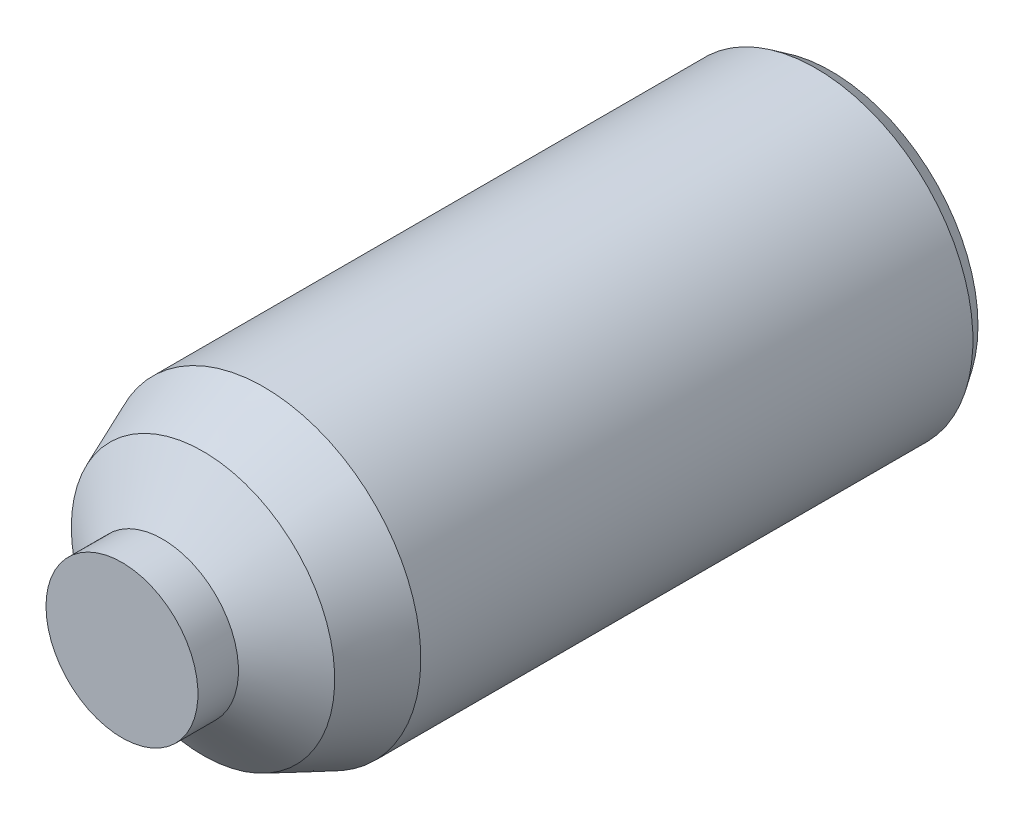
ISO-10303-21;
HEADER;
FILE_DESCRIPTION(('STEP AP214'),'2;1');
FILE_NAME('part.step','',(''),(''),'','','');
FILE_SCHEMA(('AUTOMOTIVE_DESIGN { 1 0 10303 214 1 1 1 1 }'));
ENDSEC;
DATA;
#1=APPLICATION_CONTEXT('core data for automotive mechanical design processes');
#2=APPLICATION_PROTOCOL_DEFINITION('international standard','automotive_design',2000,#1);
#3=PRODUCT_CONTEXT('',#1,'mechanical');
#4=PRODUCT('Part','Part','',(#3));
#5=PRODUCT_RELATED_PRODUCT_CATEGORY('part','',(#4));
#6=PRODUCT_DEFINITION_FORMATION('','',#4);
#7=PRODUCT_DEFINITION_CONTEXT('part definition',#1,'design');
#8=PRODUCT_DEFINITION('design','',#6,#7);
#9=PRODUCT_DEFINITION_SHAPE('','',#8);
#10=(LENGTH_UNIT() NAMED_UNIT(*) SI_UNIT(.MILLI.,.METRE.));
#11=(NAMED_UNIT(*) PLANE_ANGLE_UNIT() SI_UNIT($,.RADIAN.));
#12=(NAMED_UNIT(*) SI_UNIT($,.STERADIAN.) SOLID_ANGLE_UNIT());
#13=UNCERTAINTY_MEASURE_WITH_UNIT(LENGTH_MEASURE(1.E-05),#10,'distance_accuracy_value','');
#14=(GEOMETRIC_REPRESENTATION_CONTEXT(3) GLOBAL_UNCERTAINTY_ASSIGNED_CONTEXT((#13)) GLOBAL_UNIT_ASSIGNED_CONTEXT((#10,
#11,#12)) REPRESENTATION_CONTEXT('',''));
#15=CARTESIAN_POINT('',(0.,0.,0.));
#16=DIRECTION('',(0.,0.,1.));
#17=DIRECTION('',(1.,0.,0.));
#18=AXIS2_PLACEMENT_3D('',#15,#16,#17);
#19=CARTESIAN_POINT('',(15.,0.,140.));
#20=DIRECTION('',(0.,0.,-1.));
#21=DIRECTION('',(-1.,0.,0.));
#22=AXIS2_PLACEMENT_3D('',#19,#20,#21);
#23=PLANE('',#22);
#24=CARTESIAN_POINT('',(0.,0.,140.));
#25=DIRECTION('',(0.,0.,-1.));
#26=DIRECTION('',(-1.,0.,0.));
#27=AXIS2_PLACEMENT_3D('',#24,#25,#26);
#28=CIRCLE('',#27,15.);
#29=CARTESIAN_POINT('',(-15.,0.,140.));
#30=VERTEX_POINT('',#29);
#31=EDGE_CURVE('E62',#30,#30,#28,.T.);
#32=ORIENTED_EDGE('',*,*,#31,.F.);
#33=EDGE_LOOP('',(#32));
#34=FACE_BOUND('',#33,.T.);
#35=ADVANCED_FACE('F39',(#34),#23,.F.);
#36=CARTESIAN_POINT('',(0.,0.,0.));
#37=DIRECTION('',(0.,0.,1.));
#38=DIRECTION('',(1.,0.,0.));
#39=AXIS2_PLACEMENT_3D('',#36,#37,#38);
#40=PLANE('',#39);
#41=CARTESIAN_POINT('',(0.,0.,0.));
#42=DIRECTION('',(0.,0.,-1.));
#43=DIRECTION('',(-1.,0.,0.));
#44=AXIS2_PLACEMENT_3D('',#41,#42,#43);
#45=CIRCLE('',#44,29.);
#46=CARTESIAN_POINT('',(-29.,0.,0.));
#47=VERTEX_POINT('',#46);
#48=EDGE_CURVE('E10',#47,#47,#45,.T.);
#49=ORIENTED_EDGE('',*,*,#48,.T.);
#50=EDGE_LOOP('',(#49));
#51=FACE_BOUND('',#50,.T.);
#52=ADVANCED_FACE('F66',(#51),#40,.F.);
#53=CARTESIAN_POINT('',(0.,0.,3.));
#54=DIRECTION('',(0.,0.,1.));
#55=DIRECTION('',(1.,0.,0.));
#56=AXIS2_PLACEMENT_3D('',#53,#54,#55);
#57=CONICAL_SURFACE('',#56,31.,0.588002603547567);
#58=ORIENTED_EDGE('',*,*,#48,.F.);
#59=EDGE_LOOP('',(#58));
#60=FACE_BOUND('',#59,.T.);
#61=CARTESIAN_POINT('',(0.,0.,3.));
#62=DIRECTION('',(0.,0.,-1.));
#63=DIRECTION('',(-1.,0.,0.));
#64=AXIS2_PLACEMENT_3D('',#61,#62,#63);
#65=CIRCLE('',#64,31.);
#66=CARTESIAN_POINT('',(-31.,0.,3.));
#67=VERTEX_POINT('',#66);
#68=EDGE_CURVE('E44',#67,#67,#65,.T.);
#69=ORIENTED_EDGE('',*,*,#68,.T.);
#70=EDGE_LOOP('',(#69));
#71=FACE_BOUND('',#70,.T.);
#72=ADVANCED_FACE('F75',(#60,#71),#57,.T.);
#73=CARTESIAN_POINT('',(0.,0.,-5.));
#74=DIRECTION('',(0.,0.,-1.));
#75=DIRECTION('',(-1.,0.,0.));
#76=AXIS2_PLACEMENT_3D('',#73,#74,#75);
#77=CYLINDRICAL_SURFACE('',#76,31.);
#78=ORIENTED_EDGE('',*,*,#68,.F.);
#79=EDGE_LOOP('',(#78));
#80=FACE_BOUND('',#79,.T.);
#81=CARTESIAN_POINT('',(0.,0.,112.));
#82=DIRECTION('',(0.,0.,-1.));
#83=DIRECTION('',(-1.,0.,0.));
#84=AXIS2_PLACEMENT_3D('',#81,#82,#83);
#85=CIRCLE('',#84,31.);
#86=CARTESIAN_POINT('',(-31.,0.,112.));
#87=VERTEX_POINT('',#86);
#88=EDGE_CURVE('E47',#87,#87,#85,.T.);
#89=ORIENTED_EDGE('',*,*,#88,.T.);
#90=EDGE_LOOP('',(#89));
#91=FACE_BOUND('',#90,.T.);
#92=ADVANCED_FACE('F78',(#80,#91),#77,.T.);
#93=CARTESIAN_POINT('',(0.,0.,124.));
#94=DIRECTION('',(0.,0.,-1.));
#95=DIRECTION('',(-1.,0.,0.));
#96=AXIS2_PLACEMENT_3D('',#93,#94,#95);
#97=CONICAL_SURFACE('',#96,26.,0.394791119699761);
#98=ORIENTED_EDGE('',*,*,#88,.F.);
#99=EDGE_LOOP('',(#98));
#100=FACE_BOUND('',#99,.T.);
#101=CARTESIAN_POINT('',(0.,0.,124.));
#102=DIRECTION('',(0.,0.,-1.));
#103=DIRECTION('',(-1.,0.,0.));
#104=AXIS2_PLACEMENT_3D('',#101,#102,#103);
#105=CIRCLE('',#104,26.);
#106=CARTESIAN_POINT('',(-26.,0.,124.));
#107=VERTEX_POINT('',#106);
#108=EDGE_CURVE('E52',#107,#107,#105,.T.);
#109=ORIENTED_EDGE('',*,*,#108,.T.);
#110=EDGE_LOOP('',(#109));
#111=FACE_BOUND('',#110,.T.);
#112=ADVANCED_FACE('F85',(#100,#111),#97,.T.);
#113=CARTESIAN_POINT('',(0.,0.,132.));
#114=DIRECTION('',(0.,0.,-1.));
#115=DIRECTION('',(-1.,0.,0.));
#116=AXIS2_PLACEMENT_3D('',#113,#114,#115);
#117=CONICAL_SURFACE('',#116,15.,0.942000040379463);
#118=ORIENTED_EDGE('',*,*,#108,.F.);
#119=EDGE_LOOP('',(#118));
#120=FACE_BOUND('',#119,.T.);
#121=CARTESIAN_POINT('',(0.,0.,132.));
#122=DIRECTION('',(0.,0.,-1.));
#123=DIRECTION('',(-1.,0.,0.));
#124=AXIS2_PLACEMENT_3D('',#121,#122,#123);
#125=CIRCLE('',#124,15.);
#126=CARTESIAN_POINT('',(-15.,0.,132.));
#127=VERTEX_POINT('',#126);
#128=EDGE_CURVE('E59',#127,#127,#125,.T.);
#129=ORIENTED_EDGE('',*,*,#128,.T.);
#130=EDGE_LOOP('',(#129));
#131=FACE_BOUND('',#130,.T.);
#132=ADVANCED_FACE('F86',(#120,#131),#117,.T.);
#133=CARTESIAN_POINT('',(0.,0.,-5.));
#134=DIRECTION('',(0.,0.,-1.));
#135=DIRECTION('',(-1.,0.,0.));
#136=AXIS2_PLACEMENT_3D('',#133,#134,#135);
#137=CYLINDRICAL_SURFACE('',#136,15.);
#138=ORIENTED_EDGE('',*,*,#128,.F.);
#139=EDGE_LOOP('',(#138));
#140=FACE_BOUND('',#139,.T.);
#141=ORIENTED_EDGE('',*,*,#31,.T.);
#142=EDGE_LOOP('',(#141));
#143=FACE_BOUND('',#142,.T.);
#144=ADVANCED_FACE('F61',(#140,#143),#137,.T.);
#145=CLOSED_SHELL('',(#35,#52,#72,#92,#112,#132,#144));
#146=MANIFOLD_SOLID_BREP('B2',#145);
#147=ADVANCED_BREP_SHAPE_REPRESENTATION('',(#18,#146),#14);
#148=SHAPE_DEFINITION_REPRESENTATION(#9,#147);
ENDSEC;
END-ISO-10303-21;
